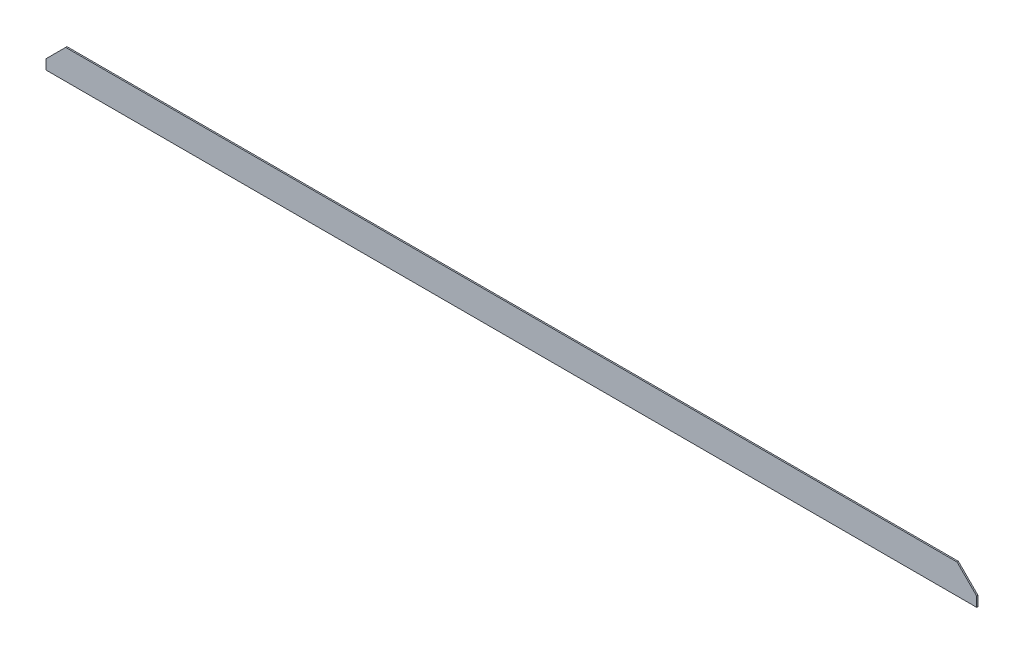
ISO-10303-21;
HEADER;
FILE_DESCRIPTION(('STEP AP214'),'2;1');
FILE_NAME('part.step','',(''),(''),'','','');
FILE_SCHEMA(('AUTOMOTIVE_DESIGN { 1 0 10303 214 1 1 1 1 }'));
ENDSEC;
DATA;
#1=APPLICATION_CONTEXT('core data for automotive mechanical design processes');
#2=APPLICATION_PROTOCOL_DEFINITION('international standard','automotive_design',2000,#1);
#3=PRODUCT_CONTEXT('',#1,'mechanical');
#4=PRODUCT('Part','Part','',(#3));
#5=PRODUCT_RELATED_PRODUCT_CATEGORY('part','',(#4));
#6=PRODUCT_DEFINITION_FORMATION('','',#4);
#7=PRODUCT_DEFINITION_CONTEXT('part definition',#1,'design');
#8=PRODUCT_DEFINITION('design','',#6,#7);
#9=PRODUCT_DEFINITION_SHAPE('','',#8);
#10=(LENGTH_UNIT() NAMED_UNIT(*) SI_UNIT(.MILLI.,.METRE.));
#11=(NAMED_UNIT(*) PLANE_ANGLE_UNIT() SI_UNIT($,.RADIAN.));
#12=(NAMED_UNIT(*) SI_UNIT($,.STERADIAN.) SOLID_ANGLE_UNIT());
#13=UNCERTAINTY_MEASURE_WITH_UNIT(LENGTH_MEASURE(1.E-05),#10,'distance_accuracy_value','');
#14=(GEOMETRIC_REPRESENTATION_CONTEXT(3) GLOBAL_UNCERTAINTY_ASSIGNED_CONTEXT((#13)) GLOBAL_UNIT_ASSIGNED_CONTEXT((#10,
#11,#12)) REPRESENTATION_CONTEXT('',''));
#15=CARTESIAN_POINT('',(0.,0.,0.));
#16=DIRECTION('',(0.,0.,1.));
#17=DIRECTION('',(1.,0.,0.));
#18=AXIS2_PLACEMENT_3D('',#15,#16,#17);
#19=CARTESIAN_POINT('',(710.5,-22.5,2.));
#20=DIRECTION('',(-1.,0.,0.));
#21=DIRECTION('',(0.,0.,1.));
#22=AXIS2_PLACEMENT_3D('',#19,#20,#21);
#23=PLANE('',#22);
#24=DIRECTION('',(0.,1.,0.));
#25=VECTOR('',#24,1.);
#26=CARTESIAN_POINT('',(710.5,-22.5,0.));
#27=LINE('',#26,#25);
#28=CARTESIAN_POINT('',(710.5,-22.5,0.));
#29=VERTEX_POINT('',#28);
#30=CARTESIAN_POINT('',(710.5,-7.50000000000003,0.));
#31=VERTEX_POINT('',#30);
#32=EDGE_CURVE('E111',#29,#31,#27,.T.);
#33=ORIENTED_EDGE('',*,*,#32,.T.);
#34=DIRECTION('',(0.,0.,1.));
#35=VECTOR('',#34,1.);
#36=CARTESIAN_POINT('',(710.5,-7.50000000000002,2.));
#37=LINE('',#36,#35);
#38=CARTESIAN_POINT('',(710.5,-7.50000000000003,2.));
#39=VERTEX_POINT('',#38);
#40=EDGE_CURVE('E55',#31,#39,#37,.T.);
#41=ORIENTED_EDGE('',*,*,#40,.T.);
#42=DIRECTION('',(0.,1.,0.));
#43=VECTOR('',#42,1.);
#44=CARTESIAN_POINT('',(710.5,-22.5,2.));
#45=LINE('',#44,#43);
#46=CARTESIAN_POINT('',(710.5,-22.5,2.));
#47=VERTEX_POINT('',#46);
#48=EDGE_CURVE('E118',#47,#39,#45,.T.);
#49=ORIENTED_EDGE('',*,*,#48,.F.);
#50=DIRECTION('',(0.,0.,-1.));
#51=VECTOR('',#50,1.);
#52=CARTESIAN_POINT('',(710.5,-22.5,2.));
#53=LINE('',#52,#51);
#54=EDGE_CURVE('E103',#47,#29,#53,.T.);
#55=ORIENTED_EDGE('',*,*,#54,.T.);
#56=EDGE_LOOP('',(#33,#41,#49,#55));
#57=FACE_BOUND('',#56,.T.);
#58=ADVANCED_FACE('F32',(#57),#23,.F.);
#59=CARTESIAN_POINT('',(-710.5,22.5,2.));
#60=DIRECTION('',(0.,-1.,0.));
#61=DIRECTION('',(0.,0.,-1.));
#62=AXIS2_PLACEMENT_3D('',#59,#60,#61);
#63=PLANE('',#62);
#64=DIRECTION('',(-1.,0.,0.));
#65=VECTOR('',#64,1.);
#66=CARTESIAN_POINT('',(-710.5,22.5,2.));
#67=LINE('',#66,#65);
#68=CARTESIAN_POINT('',(680.5,22.5,2.));
#69=VERTEX_POINT('',#68);
#70=CARTESIAN_POINT('',(-680.5,22.5,2.));
#71=VERTEX_POINT('',#70);
#72=EDGE_CURVE('E93',#69,#71,#67,.T.);
#73=ORIENTED_EDGE('',*,*,#72,.F.);
#74=DIRECTION('',(0.,0.,-1.));
#75=VECTOR('',#74,1.);
#76=CARTESIAN_POINT('',(680.5,22.5,2.));
#77=LINE('',#76,#75);
#78=CARTESIAN_POINT('',(680.5,22.5,0.));
#79=VERTEX_POINT('',#78);
#80=EDGE_CURVE('E121',#69,#79,#77,.T.);
#81=ORIENTED_EDGE('',*,*,#80,.T.);
#82=DIRECTION('',(-1.,0.,0.));
#83=VECTOR('',#82,1.);
#84=CARTESIAN_POINT('',(-710.5,22.5,0.));
#85=LINE('',#84,#83);
#86=CARTESIAN_POINT('',(-680.5,22.5,0.));
#87=VERTEX_POINT('',#86);
#88=EDGE_CURVE('E113',#79,#87,#85,.T.);
#89=ORIENTED_EDGE('',*,*,#88,.T.);
#90=DIRECTION('',(0.,0.,1.));
#91=VECTOR('',#90,1.);
#92=CARTESIAN_POINT('',(-680.5,22.5,2.));
#93=LINE('',#92,#91);
#94=EDGE_CURVE('E102',#87,#71,#93,.T.);
#95=ORIENTED_EDGE('',*,*,#94,.T.);
#96=EDGE_LOOP('',(#73,#81,#89,#95));
#97=FACE_BOUND('',#96,.T.);
#98=ADVANCED_FACE('F134',(#97),#63,.F.);
#99=CARTESIAN_POINT('',(-710.5,-22.5,2.));
#100=DIRECTION('',(1.,0.,0.));
#101=DIRECTION('',(0.,0.,-1.));
#102=AXIS2_PLACEMENT_3D('',#99,#100,#101);
#103=PLANE('',#102);
#104=DIRECTION('',(0.,-1.,0.));
#105=VECTOR('',#104,1.);
#106=CARTESIAN_POINT('',(-710.5,-22.5,2.));
#107=LINE('',#106,#105);
#108=CARTESIAN_POINT('',(-710.5,-7.50000000000003,2.));
#109=VERTEX_POINT('',#108);
#110=CARTESIAN_POINT('',(-710.5,-22.5,2.));
#111=VERTEX_POINT('',#110);
#112=EDGE_CURVE('E85',#109,#111,#107,.T.);
#113=ORIENTED_EDGE('',*,*,#112,.F.);
#114=DIRECTION('',(0.,0.,-1.));
#115=VECTOR('',#114,1.);
#116=CARTESIAN_POINT('',(-710.5,-7.50000000000002,2.));
#117=LINE('',#116,#115);
#118=CARTESIAN_POINT('',(-710.5,-7.50000000000003,0.));
#119=VERTEX_POINT('',#118);
#120=EDGE_CURVE('E11',#109,#119,#117,.T.);
#121=ORIENTED_EDGE('',*,*,#120,.T.);
#122=DIRECTION('',(0.,-1.,0.));
#123=VECTOR('',#122,1.);
#124=CARTESIAN_POINT('',(-710.5,-22.5,0.));
#125=LINE('',#124,#123);
#126=CARTESIAN_POINT('',(-710.5,-22.5,0.));
#127=VERTEX_POINT('',#126);
#128=EDGE_CURVE('E99',#119,#127,#125,.T.);
#129=ORIENTED_EDGE('',*,*,#128,.T.);
#130=DIRECTION('',(0.,0.,-1.));
#131=VECTOR('',#130,1.);
#132=CARTESIAN_POINT('',(-710.5,-22.5,2.));
#133=LINE('',#132,#131);
#134=EDGE_CURVE('E96',#111,#127,#133,.T.);
#135=ORIENTED_EDGE('',*,*,#134,.F.);
#136=EDGE_LOOP('',(#113,#121,#129,#135));
#137=FACE_BOUND('',#136,.T.);
#138=ADVANCED_FACE('F97',(#137),#103,.F.);
#139=CARTESIAN_POINT('',(-710.5,-22.5,2.));
#140=DIRECTION('',(0.,1.,0.));
#141=DIRECTION('',(0.,0.,1.));
#142=AXIS2_PLACEMENT_3D('',#139,#140,#141);
#143=PLANE('',#142);
#144=DIRECTION('',(1.,0.,0.));
#145=VECTOR('',#144,1.);
#146=CARTESIAN_POINT('',(-710.5,-22.5,0.));
#147=LINE('',#146,#145);
#148=EDGE_CURVE('E117',#127,#29,#147,.T.);
#149=ORIENTED_EDGE('',*,*,#148,.T.);
#150=ORIENTED_EDGE('',*,*,#54,.F.);
#151=DIRECTION('',(1.,0.,0.));
#152=VECTOR('',#151,1.);
#153=CARTESIAN_POINT('',(-710.5,-22.5,2.));
#154=LINE('',#153,#152);
#155=EDGE_CURVE('E89',#111,#47,#154,.T.);
#156=ORIENTED_EDGE('',*,*,#155,.F.);
#157=ORIENTED_EDGE('',*,*,#134,.T.);
#158=EDGE_LOOP('',(#149,#150,#156,#157));
#159=FACE_BOUND('',#158,.T.);
#160=ADVANCED_FACE('F105',(#159),#143,.F.);
#161=CARTESIAN_POINT('',(0.,0.,2.));
#162=DIRECTION('',(0.,0.,-1.));
#163=DIRECTION('',(-1.,0.,0.));
#164=AXIS2_PLACEMENT_3D('',#161,#162,#163);
#165=PLANE('',#164);
#166=ORIENTED_EDGE('',*,*,#48,.T.);
#167=DIRECTION('',(0.707106781186548,-0.707106781186548,0.));
#168=VECTOR('',#167,1.);
#169=CARTESIAN_POINT('',(680.5,22.5,2.));
#170=LINE('',#169,#168);
#171=EDGE_CURVE('E40',#39,#69,#170,.F.);
#172=ORIENTED_EDGE('',*,*,#171,.T.);
#173=ORIENTED_EDGE('',*,*,#72,.T.);
#174=DIRECTION('',(0.707106781186548,0.707106781186548,0.));
#175=VECTOR('',#174,1.);
#176=CARTESIAN_POINT('',(-710.5,-7.50000000000002,2.));
#177=LINE('',#176,#175);
#178=EDGE_CURVE('E47',#71,#109,#177,.F.);
#179=ORIENTED_EDGE('',*,*,#178,.T.);
#180=ORIENTED_EDGE('',*,*,#112,.T.);
#181=ORIENTED_EDGE('',*,*,#155,.T.);
#182=EDGE_LOOP('',(#166,#172,#173,#179,#180,#181));
#183=FACE_BOUND('',#182,.T.);
#184=ADVANCED_FACE('F87',(#183),#165,.F.);
#185=CARTESIAN_POINT('',(0.,0.,0.));
#186=DIRECTION('',(0.,0.,-1.));
#187=DIRECTION('',(-1.,0.,0.));
#188=AXIS2_PLACEMENT_3D('',#185,#186,#187);
#189=PLANE('',#188);
#190=ORIENTED_EDGE('',*,*,#88,.F.);
#191=DIRECTION('',(-0.707106781186548,0.707106781186548,0.));
#192=VECTOR('',#191,1.);
#193=CARTESIAN_POINT('',(351.5,351.5,0.));
#194=LINE('',#193,#192);
#195=EDGE_CURVE('E126',#79,#31,#194,.F.);
#196=ORIENTED_EDGE('',*,*,#195,.T.);
#197=ORIENTED_EDGE('',*,*,#32,.F.);
#198=ORIENTED_EDGE('',*,*,#148,.F.);
#199=ORIENTED_EDGE('',*,*,#128,.F.);
#200=DIRECTION('',(-0.707106781186548,-0.707106781186548,0.));
#201=VECTOR('',#200,1.);
#202=CARTESIAN_POINT('',(-351.5,351.5,0.));
#203=LINE('',#202,#201);
#204=EDGE_CURVE('E124',#119,#87,#203,.F.);
#205=ORIENTED_EDGE('',*,*,#204,.T.);
#206=EDGE_LOOP('',(#190,#196,#197,#198,#199,#205));
#207=FACE_BOUND('',#206,.T.);
#208=ADVANCED_FACE('F140',(#207),#189,.T.);
#209=CARTESIAN_POINT('',(680.5,22.5,2.));
#210=DIRECTION('',(-0.707106781186548,-0.707106781186548,0.));
#211=DIRECTION('',(0.,0.,-1.));
#212=AXIS2_PLACEMENT_3D('',#209,#210,#211);
#213=PLANE('',#212);
#214=ORIENTED_EDGE('',*,*,#171,.F.);
#215=ORIENTED_EDGE('',*,*,#40,.F.);
#216=ORIENTED_EDGE('',*,*,#195,.F.);
#217=ORIENTED_EDGE('',*,*,#80,.F.);
#218=EDGE_LOOP('',(#214,#215,#216,#217));
#219=FACE_BOUND('',#218,.T.);
#220=ADVANCED_FACE('F137',(#219),#213,.F.);
#221=CARTESIAN_POINT('',(-710.5,-7.50000000000002,2.));
#222=DIRECTION('',(0.707106781186548,-0.707106781186548,0.));
#223=DIRECTION('',(0.,0.,-1.));
#224=AXIS2_PLACEMENT_3D('',#221,#222,#223);
#225=PLANE('',#224);
#226=ORIENTED_EDGE('',*,*,#178,.F.);
#227=ORIENTED_EDGE('',*,*,#94,.F.);
#228=ORIENTED_EDGE('',*,*,#204,.F.);
#229=ORIENTED_EDGE('',*,*,#120,.F.);
#230=EDGE_LOOP('',(#226,#227,#228,#229));
#231=FACE_BOUND('',#230,.T.);
#232=ADVANCED_FACE('F34',(#231),#225,.F.);
#233=CLOSED_SHELL('',(#58,#98,#138,#160,#184,#208,#220,#232));
#234=MANIFOLD_SOLID_BREP('B2',#233);
#235=ADVANCED_BREP_SHAPE_REPRESENTATION('',(#18,#234),#14);
#236=SHAPE_DEFINITION_REPRESENTATION(#9,#235);
ENDSEC;
END-ISO-10303-21;
